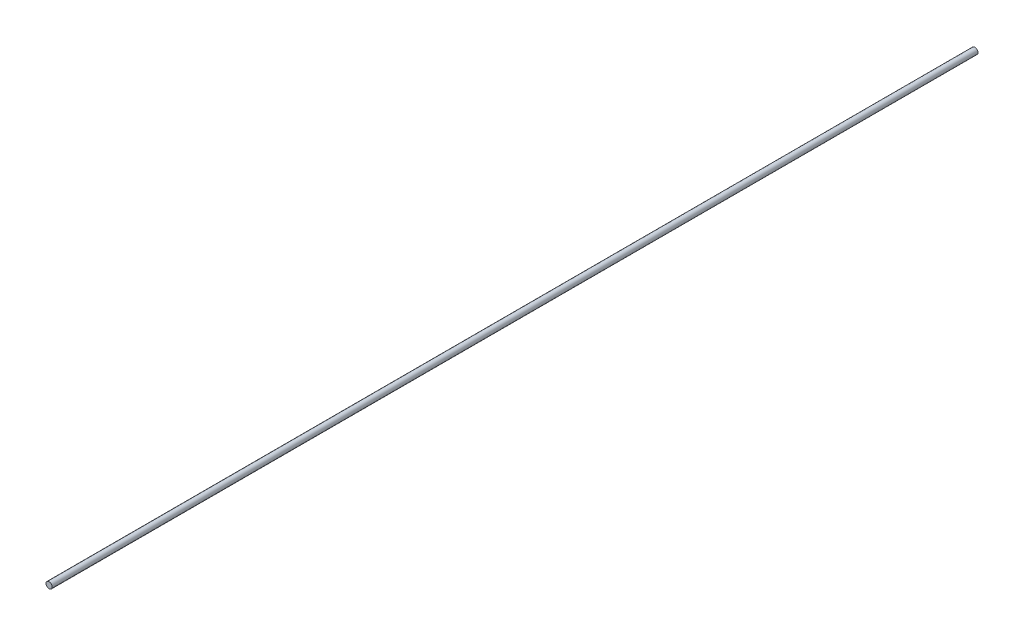
ISO-10303-21;
HEADER;
FILE_DESCRIPTION(('STEP AP214'),'2;1');
FILE_NAME('part.step','',(''),(''),'','','');
FILE_SCHEMA(('AUTOMOTIVE_DESIGN { 1 0 10303 214 1 1 1 1 }'));
ENDSEC;
DATA;
#1=APPLICATION_CONTEXT('core data for automotive mechanical design processes');
#2=APPLICATION_PROTOCOL_DEFINITION('international standard','automotive_design',2000,#1);
#3=PRODUCT_CONTEXT('',#1,'mechanical');
#4=PRODUCT('Part','Part','',(#3));
#5=PRODUCT_RELATED_PRODUCT_CATEGORY('part','',(#4));
#6=PRODUCT_DEFINITION_FORMATION('','',#4);
#7=PRODUCT_DEFINITION_CONTEXT('part definition',#1,'design');
#8=PRODUCT_DEFINITION('design','',#6,#7);
#9=PRODUCT_DEFINITION_SHAPE('','',#8);
#10=(LENGTH_UNIT() NAMED_UNIT(*) SI_UNIT(.MILLI.,.METRE.));
#11=(NAMED_UNIT(*) PLANE_ANGLE_UNIT() SI_UNIT($,.RADIAN.));
#12=(NAMED_UNIT(*) SI_UNIT($,.STERADIAN.) SOLID_ANGLE_UNIT());
#13=UNCERTAINTY_MEASURE_WITH_UNIT(LENGTH_MEASURE(1.E-05),#10,'distance_accuracy_value','');
#14=(GEOMETRIC_REPRESENTATION_CONTEXT(3) GLOBAL_UNCERTAINTY_ASSIGNED_CONTEXT((#13)) GLOBAL_UNIT_ASSIGNED_CONTEXT((#10,
#11,#12)) REPRESENTATION_CONTEXT('',''));
#15=CARTESIAN_POINT('',(0.,0.,0.));
#16=DIRECTION('',(0.,0.,1.));
#17=DIRECTION('',(1.,0.,0.));
#18=AXIS2_PLACEMENT_3D('',#15,#16,#17);
#19=CARTESIAN_POINT('',(0.,0.,150.));
#20=DIRECTION('',(0.,0.,-1.));
#21=DIRECTION('',(-1.,0.,0.));
#22=AXIS2_PLACEMENT_3D('',#19,#20,#21);
#23=CYLINDRICAL_SURFACE('',#22,0.5);
#24=CARTESIAN_POINT('',(0.,0.,150.));
#25=DIRECTION('',(0.,0.,1.));
#26=DIRECTION('',(1.,0.,0.));
#27=AXIS2_PLACEMENT_3D('',#24,#25,#26);
#28=CIRCLE('',#27,0.5);
#29=CARTESIAN_POINT('',(0.5,0.,150.));
#30=VERTEX_POINT('',#29);
#31=EDGE_CURVE('E10',#30,#30,#28,.T.);
#32=ORIENTED_EDGE('',*,*,#31,.F.);
#33=EDGE_LOOP('',(#32));
#34=FACE_BOUND('',#33,.T.);
#35=CARTESIAN_POINT('',(0.,0.,0.));
#36=DIRECTION('',(0.,0.,1.));
#37=DIRECTION('',(1.,0.,0.));
#38=AXIS2_PLACEMENT_3D('',#35,#36,#37);
#39=CIRCLE('',#38,0.5);
#40=CARTESIAN_POINT('',(0.5,0.,0.));
#41=VERTEX_POINT('',#40);
#42=EDGE_CURVE('E40',#41,#41,#39,.T.);
#43=ORIENTED_EDGE('',*,*,#42,.T.);
#44=EDGE_LOOP('',(#43));
#45=FACE_BOUND('',#44,.T.);
#46=ADVANCED_FACE('F37',(#34,#45),#23,.T.);
#47=CARTESIAN_POINT('',(0.,0.,150.));
#48=DIRECTION('',(0.,0.,1.));
#49=DIRECTION('',(1.,0.,0.));
#50=AXIS2_PLACEMENT_3D('',#47,#48,#49);
#51=PLANE('',#50);
#52=ORIENTED_EDGE('',*,*,#31,.T.);
#53=EDGE_LOOP('',(#52));
#54=FACE_BOUND('',#53,.T.);
#55=ADVANCED_FACE('F54',(#54),#51,.T.);
#56=CARTESIAN_POINT('',(0.,0.,0.));
#57=DIRECTION('',(0.,0.,1.));
#58=DIRECTION('',(1.,0.,0.));
#59=AXIS2_PLACEMENT_3D('',#56,#57,#58);
#60=PLANE('',#59);
#61=ORIENTED_EDGE('',*,*,#42,.F.);
#62=EDGE_LOOP('',(#61));
#63=FACE_BOUND('',#62,.T.);
#64=ADVANCED_FACE('F52',(#63),#60,.F.);
#65=CLOSED_SHELL('',(#46,#55,#64));
#66=MANIFOLD_SOLID_BREP('B2',#65);
#67=ADVANCED_BREP_SHAPE_REPRESENTATION('',(#18,#66),#14);
#68=SHAPE_DEFINITION_REPRESENTATION(#9,#67);
ENDSEC;
END-ISO-10303-21;
